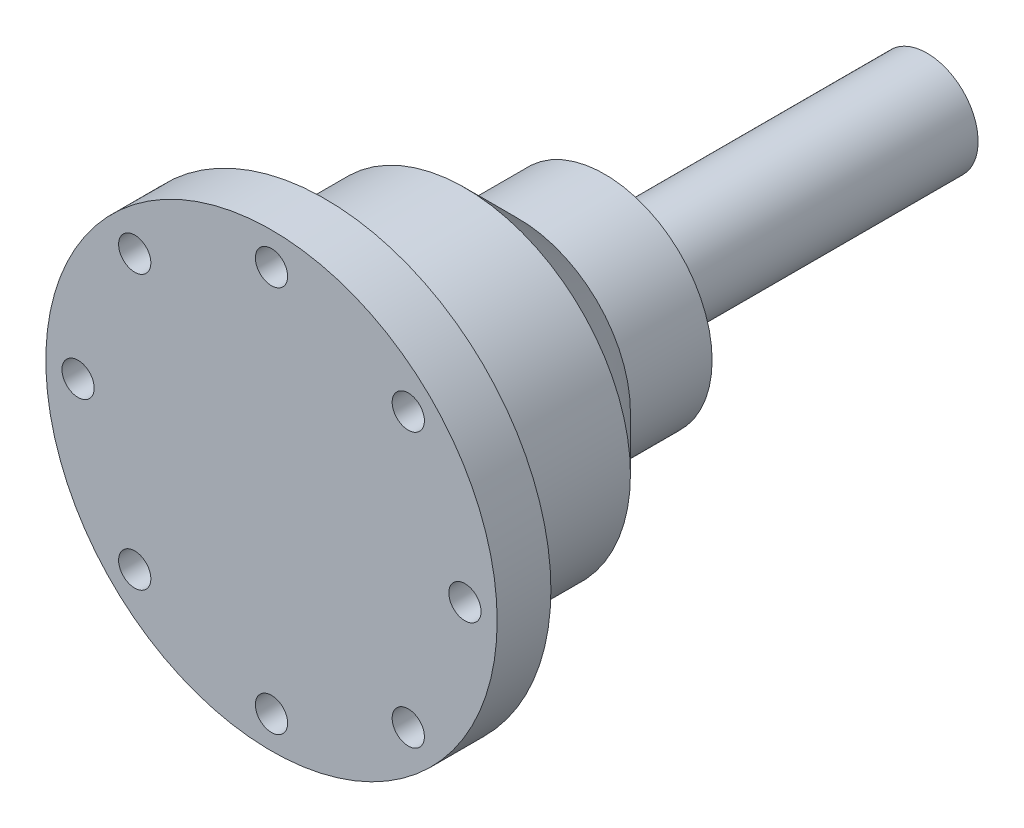
ISO-10303-21;
HEADER;
FILE_DESCRIPTION(('STEP AP214'),'2;1');
FILE_NAME('part.step','',(''),(''),'','','');
FILE_SCHEMA(('AUTOMOTIVE_DESIGN { 1 0 10303 214 1 1 1 1 }'));
ENDSEC;
DATA;
#1=APPLICATION_CONTEXT('core data for automotive mechanical design processes');
#2=APPLICATION_PROTOCOL_DEFINITION('international standard','automotive_design',2000,#1);
#3=PRODUCT_CONTEXT('',#1,'mechanical');
#4=PRODUCT('Part','Part','',(#3));
#5=PRODUCT_RELATED_PRODUCT_CATEGORY('part','',(#4));
#6=PRODUCT_DEFINITION_FORMATION('','',#4);
#7=PRODUCT_DEFINITION_CONTEXT('part definition',#1,'design');
#8=PRODUCT_DEFINITION('design','',#6,#7);
#9=PRODUCT_DEFINITION_SHAPE('','',#8);
#10=(LENGTH_UNIT() NAMED_UNIT(*) SI_UNIT(.MILLI.,.METRE.));
#11=(NAMED_UNIT(*) PLANE_ANGLE_UNIT() SI_UNIT($,.RADIAN.));
#12=(NAMED_UNIT(*) SI_UNIT($,.STERADIAN.) SOLID_ANGLE_UNIT());
#13=UNCERTAINTY_MEASURE_WITH_UNIT(LENGTH_MEASURE(1.E-05),#10,'distance_accuracy_value','');
#14=(GEOMETRIC_REPRESENTATION_CONTEXT(3) GLOBAL_UNCERTAINTY_ASSIGNED_CONTEXT((#13)) GLOBAL_UNIT_ASSIGNED_CONTEXT((#10,
#11,#12)) REPRESENTATION_CONTEXT('',''));
#15=CARTESIAN_POINT('',(0.,0.,0.));
#16=DIRECTION('',(0.,0.,1.));
#17=DIRECTION('',(1.,0.,0.));
#18=AXIS2_PLACEMENT_3D('',#15,#16,#17);
#19=CARTESIAN_POINT('',(0.,0.,5.));
#20=DIRECTION('',(0.,0.,-1.));
#21=DIRECTION('',(-1.,0.,0.));
#22=AXIS2_PLACEMENT_3D('',#19,#20,#21);
#23=CYLINDRICAL_SURFACE('',#22,21.);
#24=CARTESIAN_POINT('',(0.,0.,5.));
#25=DIRECTION('',(0.,0.,1.));
#26=DIRECTION('',(1.,0.,0.));
#27=AXIS2_PLACEMENT_3D('',#24,#25,#26);
#28=CIRCLE('',#27,21.);
#29=CARTESIAN_POINT('',(21.,0.,5.));
#30=VERTEX_POINT('',#29);
#31=EDGE_CURVE('E143',#30,#30,#28,.T.);
#32=ORIENTED_EDGE('',*,*,#31,.F.);
#33=EDGE_LOOP('',(#32));
#34=FACE_BOUND('',#33,.T.);
#35=CARTESIAN_POINT('',(0.,0.,0.));
#36=DIRECTION('',(0.,0.,1.));
#37=DIRECTION('',(1.,0.,0.));
#38=AXIS2_PLACEMENT_3D('',#35,#36,#37);
#39=CIRCLE('',#38,21.);
#40=CARTESIAN_POINT('',(21.,0.,0.));
#41=VERTEX_POINT('',#40);
#42=EDGE_CURVE('E139',#41,#41,#39,.T.);
#43=ORIENTED_EDGE('',*,*,#42,.T.);
#44=EDGE_LOOP('',(#43));
#45=FACE_BOUND('',#44,.T.);
#46=ADVANCED_FACE('F47',(#34,#45),#23,.T.);
#47=CARTESIAN_POINT('',(0.,0.,5.));
#48=DIRECTION('',(0.,0.,1.));
#49=DIRECTION('',(1.,0.,0.));
#50=AXIS2_PLACEMENT_3D('',#47,#48,#49);
#51=PLANE('',#50);
#52=CARTESIAN_POINT('',(-18.,0.,5.));
#53=DIRECTION('',(0.,0.,-1.));
#54=DIRECTION('',(0.,-1.,0.));
#55=AXIS2_PLACEMENT_3D('',#52,#53,#54);
#56=CIRCLE('',#55,1.5);
#57=CARTESIAN_POINT('',(-18.,-1.50000000000006,5.));
#58=VERTEX_POINT('',#57);
#59=EDGE_CURVE('E91',#58,#58,#56,.T.);
#60=ORIENTED_EDGE('',*,*,#59,.T.);
#61=EDGE_LOOP('',(#60));
#62=FACE_BOUND('',#61,.T.);
#63=CARTESIAN_POINT('',(-12.7279220613578,-12.7279220613579,5.));
#64=DIRECTION('',(0.,0.,-1.));
#65=DIRECTION('',(0.707106781186551,-0.707106781186544,0.));
#66=AXIS2_PLACEMENT_3D('',#63,#64,#65);
#67=CIRCLE('',#66,1.5);
#68=CARTESIAN_POINT('',(-11.667261889578,-13.7885822331377,5.));
#69=VERTEX_POINT('',#68);
#70=EDGE_CURVE('E100',#69,#69,#67,.T.);
#71=ORIENTED_EDGE('',*,*,#70,.T.);
#72=EDGE_LOOP('',(#71));
#73=FACE_BOUND('',#72,.T.);
#74=CARTESIAN_POINT('',(0.,-18.,5.));
#75=DIRECTION('',(0.,0.,-1.));
#76=DIRECTION('',(1.,0.,0.));
#77=AXIS2_PLACEMENT_3D('',#74,#75,#76);
#78=CIRCLE('',#77,1.5);
#79=CARTESIAN_POINT('',(1.5,-18.,5.));
#80=VERTEX_POINT('',#79);
#81=EDGE_CURVE('E108',#80,#80,#78,.T.);
#82=ORIENTED_EDGE('',*,*,#81,.T.);
#83=EDGE_LOOP('',(#82));
#84=FACE_BOUND('',#83,.T.);
#85=CARTESIAN_POINT('',(12.727922061358,-12.7279220613577,5.));
#86=DIRECTION('',(0.,0.,-1.));
#87=DIRECTION('',(0.707106781186541,0.707106781186554,0.));
#88=AXIS2_PLACEMENT_3D('',#85,#86,#87);
#89=CIRCLE('',#88,1.5);
#90=CARTESIAN_POINT('',(13.7885822331378,-11.6672618895779,5.));
#91=VERTEX_POINT('',#90);
#92=EDGE_CURVE('E116',#91,#91,#89,.T.);
#93=ORIENTED_EDGE('',*,*,#92,.T.);
#94=EDGE_LOOP('',(#93));
#95=FACE_BOUND('',#94,.T.);
#96=CARTESIAN_POINT('',(18.,1.88539992297529E-13,5.));
#97=DIRECTION('',(0.,0.,-1.));
#98=DIRECTION('',(0.,1.,0.));
#99=AXIS2_PLACEMENT_3D('',#96,#97,#98);
#100=CIRCLE('',#99,1.5);
#101=CARTESIAN_POINT('',(18.,1.50000000000019,5.));
#102=VERTEX_POINT('',#101);
#103=EDGE_CURVE('E75',#102,#102,#100,.T.);
#104=ORIENTED_EDGE('',*,*,#103,.T.);
#105=EDGE_LOOP('',(#104));
#106=FACE_BOUND('',#105,.T.);
#107=CARTESIAN_POINT('',(12.7279220613577,12.727922061358,5.));
#108=DIRECTION('',(0.,0.,-1.));
#109=DIRECTION('',(-0.707106781186556,0.707106781186539,0.));
#110=AXIS2_PLACEMENT_3D('',#107,#108,#109);
#111=CIRCLE('',#110,1.5);
#112=CARTESIAN_POINT('',(11.6672618895779,13.7885822331378,5.));
#113=VERTEX_POINT('',#112);
#114=EDGE_CURVE('E84',#113,#113,#111,.T.);
#115=ORIENTED_EDGE('',*,*,#114,.T.);
#116=EDGE_LOOP('',(#115));
#117=FACE_BOUND('',#116,.T.);
#118=CARTESIAN_POINT('',(-12.7279220613579,12.7279220613578,5.));
#119=DIRECTION('',(0.,0.,-1.));
#120=DIRECTION('',(-0.707106781186546,-0.707106781186549,0.));
#121=AXIS2_PLACEMENT_3D('',#118,#119,#120);
#122=CIRCLE('',#121,1.5);
#123=CARTESIAN_POINT('',(-13.7885822331377,11.667261889578,5.));
#124=VERTEX_POINT('',#123);
#125=EDGE_CURVE('E123',#124,#124,#122,.T.);
#126=ORIENTED_EDGE('',*,*,#125,.T.);
#127=EDGE_LOOP('',(#126));
#128=FACE_BOUND('',#127,.T.);
#129=CARTESIAN_POINT('',(0.,18.,5.));
#130=DIRECTION('',(0.,0.,-1.));
#131=DIRECTION('',(-1.,0.,0.));
#132=AXIS2_PLACEMENT_3D('',#129,#130,#131);
#133=CIRCLE('',#132,1.5);
#134=CARTESIAN_POINT('',(-1.5,18.,5.));
#135=VERTEX_POINT('',#134);
#136=EDGE_CURVE('E135',#135,#135,#133,.T.);
#137=ORIENTED_EDGE('',*,*,#136,.T.);
#138=EDGE_LOOP('',(#137));
#139=FACE_BOUND('',#138,.T.);
#140=ORIENTED_EDGE('',*,*,#31,.T.);
#141=EDGE_LOOP('',(#140));
#142=FACE_BOUND('',#141,.T.);
#143=ADVANCED_FACE('F174',(#62,#73,#84,#95,#106,#117,#128,#139,#142),#51,.T.);
#144=CARTESIAN_POINT('',(0.,0.,0.));
#145=DIRECTION('',(0.,0.,1.));
#146=DIRECTION('',(1.,0.,0.));
#147=AXIS2_PLACEMENT_3D('',#144,#145,#146);
#148=PLANE('',#147);
#149=CARTESIAN_POINT('',(0.,0.,0.));
#150=DIRECTION('',(0.,0.,1.));
#151=DIRECTION('',(1.,0.,0.));
#152=AXIS2_PLACEMENT_3D('',#149,#150,#151);
#153=CIRCLE('',#152,15.4);
#154=CARTESIAN_POINT('',(15.4,0.,0.));
#155=VERTEX_POINT('',#154);
#156=EDGE_CURVE('E71',#155,#155,#153,.T.);
#157=ORIENTED_EDGE('',*,*,#156,.T.);
#158=EDGE_LOOP('',(#157));
#159=FACE_BOUND('',#158,.T.);
#160=CARTESIAN_POINT('',(-18.,0.,0.));
#161=DIRECTION('',(0.,0.,-1.));
#162=DIRECTION('',(0.,-1.,0.));
#163=AXIS2_PLACEMENT_3D('',#160,#161,#162);
#164=CIRCLE('',#163,1.5);
#165=CARTESIAN_POINT('',(-18.,-1.50000000000006,0.));
#166=VERTEX_POINT('',#165);
#167=EDGE_CURVE('E96',#166,#166,#164,.T.);
#168=ORIENTED_EDGE('',*,*,#167,.F.);
#169=EDGE_LOOP('',(#168));
#170=FACE_BOUND('',#169,.T.);
#171=CARTESIAN_POINT('',(-12.7279220613578,-12.7279220613579,0.));
#172=DIRECTION('',(0.,0.,-1.));
#173=DIRECTION('',(0.707106781186551,-0.707106781186544,0.));
#174=AXIS2_PLACEMENT_3D('',#171,#172,#173);
#175=CIRCLE('',#174,1.5);
#176=CARTESIAN_POINT('',(-11.667261889578,-13.7885822331377,0.));
#177=VERTEX_POINT('',#176);
#178=EDGE_CURVE('E104',#177,#177,#175,.T.);
#179=ORIENTED_EDGE('',*,*,#178,.F.);
#180=EDGE_LOOP('',(#179));
#181=FACE_BOUND('',#180,.T.);
#182=CARTESIAN_POINT('',(0.,-18.,0.));
#183=DIRECTION('',(0.,0.,-1.));
#184=DIRECTION('',(1.,0.,0.));
#185=AXIS2_PLACEMENT_3D('',#182,#183,#184);
#186=CIRCLE('',#185,1.5);
#187=CARTESIAN_POINT('',(1.5,-18.,0.));
#188=VERTEX_POINT('',#187);
#189=EDGE_CURVE('E112',#188,#188,#186,.T.);
#190=ORIENTED_EDGE('',*,*,#189,.F.);
#191=EDGE_LOOP('',(#190));
#192=FACE_BOUND('',#191,.T.);
#193=CARTESIAN_POINT('',(12.727922061358,-12.7279220613577,0.));
#194=DIRECTION('',(0.,0.,-1.));
#195=DIRECTION('',(0.707106781186541,0.707106781186554,0.));
#196=AXIS2_PLACEMENT_3D('',#193,#194,#195);
#197=CIRCLE('',#196,1.5);
#198=CARTESIAN_POINT('',(13.7885822331378,-11.6672618895779,0.));
#199=VERTEX_POINT('',#198);
#200=EDGE_CURVE('E79',#199,#199,#197,.T.);
#201=ORIENTED_EDGE('',*,*,#200,.F.);
#202=EDGE_LOOP('',(#201));
#203=FACE_BOUND('',#202,.T.);
#204=CARTESIAN_POINT('',(18.,1.88539992297529E-13,0.));
#205=DIRECTION('',(0.,0.,-1.));
#206=DIRECTION('',(0.,1.,0.));
#207=AXIS2_PLACEMENT_3D('',#204,#205,#206);
#208=CIRCLE('',#207,1.5);
#209=CARTESIAN_POINT('',(18.,1.50000000000019,0.));
#210=VERTEX_POINT('',#209);
#211=EDGE_CURVE('E80',#210,#210,#208,.T.);
#212=ORIENTED_EDGE('',*,*,#211,.F.);
#213=EDGE_LOOP('',(#212));
#214=FACE_BOUND('',#213,.T.);
#215=CARTESIAN_POINT('',(12.7279220613577,12.727922061358,0.));
#216=DIRECTION('',(0.,0.,-1.));
#217=DIRECTION('',(-0.707106781186556,0.707106781186539,0.));
#218=AXIS2_PLACEMENT_3D('',#215,#216,#217);
#219=CIRCLE('',#218,1.5);
#220=CARTESIAN_POINT('',(11.6672618895779,13.7885822331378,0.));
#221=VERTEX_POINT('',#220);
#222=EDGE_CURVE('E70',#221,#221,#219,.T.);
#223=ORIENTED_EDGE('',*,*,#222,.F.);
#224=EDGE_LOOP('',(#223));
#225=FACE_BOUND('',#224,.T.);
#226=CARTESIAN_POINT('',(-12.7279220613579,12.7279220613578,0.));
#227=DIRECTION('',(0.,0.,-1.));
#228=DIRECTION('',(-0.707106781186546,-0.707106781186549,0.));
#229=AXIS2_PLACEMENT_3D('',#226,#227,#228);
#230=CIRCLE('',#229,1.5);
#231=CARTESIAN_POINT('',(-13.7885822331377,11.667261889578,0.));
#232=VERTEX_POINT('',#231);
#233=EDGE_CURVE('E95',#232,#232,#230,.T.);
#234=ORIENTED_EDGE('',*,*,#233,.F.);
#235=EDGE_LOOP('',(#234));
#236=FACE_BOUND('',#235,.T.);
#237=CARTESIAN_POINT('',(0.,18.,0.));
#238=DIRECTION('',(0.,0.,-1.));
#239=DIRECTION('',(-1.,0.,0.));
#240=AXIS2_PLACEMENT_3D('',#237,#238,#239);
#241=CIRCLE('',#240,1.5);
#242=CARTESIAN_POINT('',(-1.5,18.,0.));
#243=VERTEX_POINT('',#242);
#244=EDGE_CURVE('E134',#243,#243,#241,.T.);
#245=ORIENTED_EDGE('',*,*,#244,.F.);
#246=EDGE_LOOP('',(#245));
#247=FACE_BOUND('',#246,.T.);
#248=ORIENTED_EDGE('',*,*,#42,.F.);
#249=EDGE_LOOP('',(#248));
#250=FACE_BOUND('',#249,.T.);
#251=ADVANCED_FACE('F180',(#159,#170,#181,#192,#203,#214,#225,#236,#247,#250),#148,.F.);
#252=CARTESIAN_POINT('',(0.,18.,5.));
#253=DIRECTION('',(0.,0.,-1.));
#254=DIRECTION('',(-1.,0.,0.));
#255=AXIS2_PLACEMENT_3D('',#252,#253,#254);
#256=CYLINDRICAL_SURFACE('',#255,1.5);
#257=ORIENTED_EDGE('',*,*,#136,.F.);
#258=EDGE_LOOP('',(#257));
#259=FACE_BOUND('',#258,.T.);
#260=ORIENTED_EDGE('',*,*,#244,.T.);
#261=EDGE_LOOP('',(#260));
#262=FACE_BOUND('',#261,.T.);
#263=ADVANCED_FACE('F187',(#259,#262),#256,.F.);
#264=CARTESIAN_POINT('',(-12.7279220613579,12.7279220613578,5.));
#265=DIRECTION('',(0.,0.,-1.));
#266=DIRECTION('',(-1.,0.,0.));
#267=AXIS2_PLACEMENT_3D('',#264,#265,#266);
#268=CYLINDRICAL_SURFACE('',#267,1.5);
#269=ORIENTED_EDGE('',*,*,#125,.F.);
#270=EDGE_LOOP('',(#269));
#271=FACE_BOUND('',#270,.T.);
#272=ORIENTED_EDGE('',*,*,#233,.T.);
#273=EDGE_LOOP('',(#272));
#274=FACE_BOUND('',#273,.T.);
#275=ADVANCED_FACE('F190',(#271,#274),#268,.F.);
#276=CARTESIAN_POINT('',(12.7279220613577,12.727922061358,5.));
#277=DIRECTION('',(0.,0.,-1.));
#278=DIRECTION('',(-1.,0.,0.));
#279=AXIS2_PLACEMENT_3D('',#276,#277,#278);
#280=CYLINDRICAL_SURFACE('',#279,1.5);
#281=ORIENTED_EDGE('',*,*,#114,.F.);
#282=EDGE_LOOP('',(#281));
#283=FACE_BOUND('',#282,.T.);
#284=ORIENTED_EDGE('',*,*,#222,.T.);
#285=EDGE_LOOP('',(#284));
#286=FACE_BOUND('',#285,.T.);
#287=ADVANCED_FACE('F198',(#283,#286),#280,.F.);
#288=CARTESIAN_POINT('',(18.,1.88539992297529E-13,5.));
#289=DIRECTION('',(0.,0.,-1.));
#290=DIRECTION('',(-1.,0.,0.));
#291=AXIS2_PLACEMENT_3D('',#288,#289,#290);
#292=CYLINDRICAL_SURFACE('',#291,1.5);
#293=ORIENTED_EDGE('',*,*,#103,.F.);
#294=EDGE_LOOP('',(#293));
#295=FACE_BOUND('',#294,.T.);
#296=ORIENTED_EDGE('',*,*,#211,.T.);
#297=EDGE_LOOP('',(#296));
#298=FACE_BOUND('',#297,.T.);
#299=ADVANCED_FACE('F204',(#295,#298),#292,.F.);
#300=CARTESIAN_POINT('',(12.727922061358,-12.7279220613577,5.));
#301=DIRECTION('',(0.,0.,-1.));
#302=DIRECTION('',(-1.,0.,0.));
#303=AXIS2_PLACEMENT_3D('',#300,#301,#302);
#304=CYLINDRICAL_SURFACE('',#303,1.5);
#305=ORIENTED_EDGE('',*,*,#92,.F.);
#306=EDGE_LOOP('',(#305));
#307=FACE_BOUND('',#306,.T.);
#308=ORIENTED_EDGE('',*,*,#200,.T.);
#309=EDGE_LOOP('',(#308));
#310=FACE_BOUND('',#309,.T.);
#311=ADVANCED_FACE('F200',(#307,#310),#304,.F.);
#312=CARTESIAN_POINT('',(0.,-18.,5.));
#313=DIRECTION('',(0.,0.,-1.));
#314=DIRECTION('',(-1.,0.,0.));
#315=AXIS2_PLACEMENT_3D('',#312,#313,#314);
#316=CYLINDRICAL_SURFACE('',#315,1.5);
#317=ORIENTED_EDGE('',*,*,#81,.F.);
#318=EDGE_LOOP('',(#317));
#319=FACE_BOUND('',#318,.T.);
#320=ORIENTED_EDGE('',*,*,#189,.T.);
#321=EDGE_LOOP('',(#320));
#322=FACE_BOUND('',#321,.T.);
#323=ADVANCED_FACE('F203',(#319,#322),#316,.F.);
#324=CARTESIAN_POINT('',(-12.7279220613578,-12.7279220613579,5.));
#325=DIRECTION('',(0.,0.,-1.));
#326=DIRECTION('',(-1.,0.,0.));
#327=AXIS2_PLACEMENT_3D('',#324,#325,#326);
#328=CYLINDRICAL_SURFACE('',#327,1.5);
#329=ORIENTED_EDGE('',*,*,#70,.F.);
#330=EDGE_LOOP('',(#329));
#331=FACE_BOUND('',#330,.T.);
#332=ORIENTED_EDGE('',*,*,#178,.T.);
#333=EDGE_LOOP('',(#332));
#334=FACE_BOUND('',#333,.T.);
#335=ADVANCED_FACE('F208',(#331,#334),#328,.F.);
#336=CARTESIAN_POINT('',(-18.,0.,5.));
#337=DIRECTION('',(0.,0.,-1.));
#338=DIRECTION('',(-1.,0.,0.));
#339=AXIS2_PLACEMENT_3D('',#336,#337,#338);
#340=CYLINDRICAL_SURFACE('',#339,1.5);
#341=ORIENTED_EDGE('',*,*,#59,.F.);
#342=EDGE_LOOP('',(#341));
#343=FACE_BOUND('',#342,.T.);
#344=ORIENTED_EDGE('',*,*,#167,.T.);
#345=EDGE_LOOP('',(#344));
#346=FACE_BOUND('',#345,.T.);
#347=ADVANCED_FACE('F212',(#343,#346),#340,.F.);
#348=CARTESIAN_POINT('',(0.,0.,-18.));
#349=DIRECTION('',(0.,0.,1.));
#350=DIRECTION('',(1.,0.,0.));
#351=AXIS2_PLACEMENT_3D('',#348,#349,#350);
#352=CYLINDRICAL_SURFACE('',#351,15.4);
#353=CARTESIAN_POINT('',(0.,0.,-13.));
#354=DIRECTION('',(0.,0.,1.));
#355=DIRECTION('',(1.,0.,0.));
#356=AXIS2_PLACEMENT_3D('',#353,#354,#355);
#357=CIRCLE('',#356,15.4);
#358=CARTESIAN_POINT('',(15.4,0.,-13.));
#359=VERTEX_POINT('',#358);
#360=EDGE_CURVE('E62',#359,#359,#357,.T.);
#361=ORIENTED_EDGE('',*,*,#360,.T.);
#362=EDGE_LOOP('',(#361));
#363=FACE_BOUND('',#362,.T.);
#364=ORIENTED_EDGE('',*,*,#156,.F.);
#365=EDGE_LOOP('',(#364));
#366=FACE_BOUND('',#365,.T.);
#367=ADVANCED_FACE('F153',(#363,#366),#352,.T.);
#368=CARTESIAN_POINT('',(0.,0.,-18.));
#369=DIRECTION('',(0.,0.,1.));
#370=DIRECTION('',(1.,0.,0.));
#371=AXIS2_PLACEMENT_3D('',#368,#369,#370);
#372=PLANE('',#371);
#373=CARTESIAN_POINT('',(0.,0.,-18.));
#374=DIRECTION('',(0.,0.,1.));
#375=DIRECTION('',(1.,0.,0.));
#376=AXIS2_PLACEMENT_3D('',#373,#374,#375);
#377=CIRCLE('',#376,10.4);
#378=CARTESIAN_POINT('',(10.4,0.,-18.));
#379=VERTEX_POINT('',#378);
#380=EDGE_CURVE('E52',#379,#379,#377,.F.);
#381=ORIENTED_EDGE('',*,*,#380,.T.);
#382=EDGE_LOOP('',(#381));
#383=FACE_BOUND('',#382,.T.);
#384=CARTESIAN_POINT('',(0.,0.,-18.));
#385=DIRECTION('',(0.,0.,1.));
#386=DIRECTION('',(1.,0.,0.));
#387=AXIS2_PLACEMENT_3D('',#384,#385,#386);
#388=CIRCLE('',#387,10.);
#389=CARTESIAN_POINT('',(10.,0.,-18.));
#390=VERTEX_POINT('',#389);
#391=EDGE_CURVE('E66',#390,#390,#388,.T.);
#392=ORIENTED_EDGE('',*,*,#391,.T.);
#393=EDGE_LOOP('',(#392));
#394=FACE_BOUND('',#393,.T.);
#395=ADVANCED_FACE('F194',(#383,#394),#372,.F.);
#396=CARTESIAN_POINT('',(0.,0.,-26.));
#397=DIRECTION('',(0.,0.,1.));
#398=DIRECTION('',(1.,0.,0.));
#399=AXIS2_PLACEMENT_3D('',#396,#397,#398);
#400=PLANE('',#399);
#401=CARTESIAN_POINT('',(0.,0.,-26.));
#402=DIRECTION('',(0.,0.,-1.));
#403=DIRECTION('',(-1.,0.,0.));
#404=AXIS2_PLACEMENT_3D('',#401,#402,#403);
#405=CIRCLE('',#404,4.75);
#406=CARTESIAN_POINT('',(-4.75,0.,-26.));
#407=VERTEX_POINT('',#406);
#408=EDGE_CURVE('E10',#407,#407,#405,.T.);
#409=ORIENTED_EDGE('',*,*,#408,.F.);
#410=EDGE_LOOP('',(#409));
#411=FACE_BOUND('',#410,.T.);
#412=CARTESIAN_POINT('',(0.,0.,-26.));
#413=DIRECTION('',(0.,0.,1.));
#414=DIRECTION('',(1.,0.,0.));
#415=AXIS2_PLACEMENT_3D('',#412,#413,#414);
#416=CIRCLE('',#415,10.);
#417=CARTESIAN_POINT('',(10.,0.,-26.));
#418=VERTEX_POINT('',#417);
#419=EDGE_CURVE('E127',#418,#418,#416,.T.);
#420=ORIENTED_EDGE('',*,*,#419,.F.);
#421=EDGE_LOOP('',(#420));
#422=FACE_BOUND('',#421,.T.);
#423=ADVANCED_FACE('F169',(#411,#422),#400,.F.);
#424=CARTESIAN_POINT('',(0.,0.,-26.));
#425=DIRECTION('',(0.,0.,1.));
#426=DIRECTION('',(1.,0.,0.));
#427=AXIS2_PLACEMENT_3D('',#424,#425,#426);
#428=CYLINDRICAL_SURFACE('',#427,10.);
#429=CARTESIAN_POINT('',(10.,0.,-26.));
#430=CARTESIAN_POINT('',(10.,0.,-25.9166666666667));
#431=CARTESIAN_POINT('',(10.,0.,-25.8333333333333));
#432=CARTESIAN_POINT('',(10.,0.,-25.6666666666667));
#433=CARTESIAN_POINT('',(10.,0.,-25.5833333333333));
#434=CARTESIAN_POINT('',(10.,0.,-25.4166666666667));
#435=CARTESIAN_POINT('',(10.,0.,-25.3333333333333));
#436=CARTESIAN_POINT('',(10.,0.,-25.1666666666667));
#437=CARTESIAN_POINT('',(10.,0.,-25.0833333333333));
#438=CARTESIAN_POINT('',(10.,0.,-24.9166666666667));
#439=CARTESIAN_POINT('',(10.,0.,-24.8333333333333));
#440=CARTESIAN_POINT('',(10.,0.,-24.6666666666667));
#441=CARTESIAN_POINT('',(10.,0.,-24.5833333333333));
#442=CARTESIAN_POINT('',(10.,0.,-24.4166666666667));
#443=CARTESIAN_POINT('',(10.,0.,-24.3333333333333));
#444=CARTESIAN_POINT('',(10.,0.,-24.1666666666667));
#445=CARTESIAN_POINT('',(10.,0.,-24.0833333333333));
#446=CARTESIAN_POINT('',(10.,0.,-23.9166666666667));
#447=CARTESIAN_POINT('',(10.,0.,-23.8333333333333));
#448=CARTESIAN_POINT('',(10.,0.,-23.6666666666667));
#449=CARTESIAN_POINT('',(10.,0.,-23.5833333333333));
#450=CARTESIAN_POINT('',(10.,0.,-23.4166666666667));
#451=CARTESIAN_POINT('',(10.,0.,-23.3333333333333));
#452=CARTESIAN_POINT('',(10.,0.,-23.1666666666667));
#453=CARTESIAN_POINT('',(10.,0.,-23.0833333333333));
#454=CARTESIAN_POINT('',(10.,0.,-22.9166666666667));
#455=CARTESIAN_POINT('',(10.,0.,-22.8333333333333));
#456=CARTESIAN_POINT('',(10.,0.,-22.6666666666667));
#457=CARTESIAN_POINT('',(10.,0.,-22.5833333333333));
#458=CARTESIAN_POINT('',(10.,0.,-22.4166666666667));
#459=CARTESIAN_POINT('',(10.,0.,-22.3333333333333));
#460=CARTESIAN_POINT('',(10.,0.,-22.1666666666667));
#461=CARTESIAN_POINT('',(10.,0.,-22.0833333333333));
#462=CARTESIAN_POINT('',(10.,0.,-21.9166666666667));
#463=CARTESIAN_POINT('',(10.,0.,-21.8333333333333));
#464=CARTESIAN_POINT('',(10.,0.,-21.6666666666667));
#465=CARTESIAN_POINT('',(10.,0.,-21.5833333333333));
#466=CARTESIAN_POINT('',(10.,0.,-21.4166666666667));
#467=CARTESIAN_POINT('',(10.,0.,-21.3333333333333));
#468=CARTESIAN_POINT('',(10.,0.,-21.1666666666667));
#469=CARTESIAN_POINT('',(10.,0.,-21.0833333333333));
#470=CARTESIAN_POINT('',(10.,0.,-20.9166666666667));
#471=CARTESIAN_POINT('',(10.,0.,-20.8333333333333));
#472=CARTESIAN_POINT('',(10.,0.,-20.6666666666667));
#473=CARTESIAN_POINT('',(10.,0.,-20.5833333333333));
#474=CARTESIAN_POINT('',(10.,0.,-20.4166666666667));
#475=CARTESIAN_POINT('',(10.,0.,-20.3333333333333));
#476=CARTESIAN_POINT('',(10.,0.,-20.1666666666667));
#477=CARTESIAN_POINT('',(10.,0.,-20.0833333333333));
#478=CARTESIAN_POINT('',(10.,0.,-19.9166666666667));
#479=CARTESIAN_POINT('',(10.,0.,-19.8333333333333));
#480=CARTESIAN_POINT('',(10.,0.,-19.6666666666667));
#481=CARTESIAN_POINT('',(10.,0.,-19.5833333333333));
#482=CARTESIAN_POINT('',(10.,0.,-19.4166666666667));
#483=CARTESIAN_POINT('',(10.,0.,-19.3333333333333));
#484=CARTESIAN_POINT('',(10.,0.,-19.1666666666667));
#485=CARTESIAN_POINT('',(10.,0.,-19.0833333333333));
#486=CARTESIAN_POINT('',(10.,0.,-18.9166666666667));
#487=CARTESIAN_POINT('',(10.,0.,-18.8333333333333));
#488=CARTESIAN_POINT('',(10.,0.,-18.6666666666667));
#489=CARTESIAN_POINT('',(10.,0.,-18.5833333333333));
#490=CARTESIAN_POINT('',(10.,0.,-18.4166666666667));
#491=CARTESIAN_POINT('',(10.,0.,-18.3333333333333));
#492=CARTESIAN_POINT('',(10.,0.,-18.1666666666667));
#493=CARTESIAN_POINT('',(10.,0.,-18.0833333333333));
#494=CARTESIAN_POINT('',(10.,0.,-18.));
#495=B_SPLINE_CURVE_WITH_KNOTS('',3,(#429,#430,#431,#432,#433,#434,#435,#436,#437,#438,#439,
#440,#441,#442,#443,#444,#445,#446,#447,#448,#449,#450,#451,#452,#453,#454,#455,#456,#457,#458,
#459,#460,#461,#462,#463,#464,#465,#466,#467,#468,#469,#470,#471,#472,#473,#474,#475,#476,#477,
#478,#479,#480,#481,#482,#483,#484,#485,#486,#487,#488,#489,#490,#491,#492,#493,#494),
.UNSPECIFIED.,.F.,.F.,(4,2,2,2,2,2,2,2,2,2,2,2,2,2,2,2,2,2,2,2,2,2,2,2,2,2,2,2,2,2,2,2,4),(0.,
0.249999999999997,0.499999999999997,0.749999999999997,0.999999999999997,1.25,1.5,1.75,2.,2.25,
2.5,2.75,3.,3.25,3.5,3.75,4.,4.25,4.5,4.75,5.,5.25,5.5,5.75,6.,6.25,6.5,6.75,7.,7.25,7.5,7.75,
8.),.UNSPECIFIED.);
#496=EDGE_CURVE('BSEAM158',#418,#390,#495,.T.);
#497=ORIENTED_EDGE('',*,*,#419,.T.);
#498=ORIENTED_EDGE('',*,*,#391,.F.);
#499=ORIENTED_EDGE('',*,*,#496,.T.);
#500=ORIENTED_EDGE('',*,*,#496,.F.);
#501=EDGE_LOOP('',(#497,#499,#498,#500));
#502=FACE_BOUND('',#501,.T.);
#503=ADVANCED_FACE('F158',(#502),#428,.T.);
#504=CARTESIAN_POINT('',(0.,0.,-13.));
#505=DIRECTION('',(0.,0.,1.));
#506=DIRECTION('',(1.,0.,0.));
#507=AXIS2_PLACEMENT_3D('',#504,#505,#506);
#508=CONICAL_SURFACE('',#507,15.4,0.78539816339745);
#509=ORIENTED_EDGE('',*,*,#380,.F.);
#510=EDGE_LOOP('',(#509));
#511=FACE_BOUND('',#510,.T.);
#512=ORIENTED_EDGE('',*,*,#360,.F.);
#513=EDGE_LOOP('',(#512));
#514=FACE_BOUND('',#513,.T.);
#515=ADVANCED_FACE('F50',(#511,#514),#508,.T.);
#516=CARTESIAN_POINT('',(0.,0.,-56.));
#517=DIRECTION('',(0.,0.,1.));
#518=DIRECTION('',(1.,0.,0.));
#519=AXIS2_PLACEMENT_3D('',#516,#517,#518);
#520=CYLINDRICAL_SURFACE('',#519,4.75);
#521=CARTESIAN_POINT('',(0.,0.,-56.));
#522=DIRECTION('',(0.,0.,-1.));
#523=DIRECTION('',(-1.,0.,0.));
#524=AXIS2_PLACEMENT_3D('',#521,#522,#523);
#525=CIRCLE('',#524,4.75);
#526=CARTESIAN_POINT('',(-4.75,0.,-56.));
#527=VERTEX_POINT('',#526);
#528=EDGE_CURVE('E65',#527,#527,#525,.T.);
#529=ORIENTED_EDGE('',*,*,#528,.F.);
#530=EDGE_LOOP('',(#529));
#531=FACE_BOUND('',#530,.T.);
#532=ORIENTED_EDGE('',*,*,#408,.T.);
#533=EDGE_LOOP('',(#532));
#534=FACE_BOUND('',#533,.T.);
#535=ADVANCED_FACE('F157',(#531,#534),#520,.T.);
#536=CARTESIAN_POINT('',(0.,0.,-56.));
#537=DIRECTION('',(0.,0.,-1.));
#538=DIRECTION('',(-1.,0.,0.));
#539=AXIS2_PLACEMENT_3D('',#536,#537,#538);
#540=PLANE('',#539);
#541=ORIENTED_EDGE('',*,*,#528,.T.);
#542=EDGE_LOOP('',(#541));
#543=FACE_BOUND('',#542,.T.);
#544=ADVANCED_FACE('F165',(#543),#540,.T.);
#545=CLOSED_SHELL('',(#46,#143,#251,#263,#275,#287,#299,#311,#323,#335,#347,#367,#395,#423,#503,
#515,#535,#544));
#546=MANIFOLD_SOLID_BREP('B2',#545);
#547=ADVANCED_BREP_SHAPE_REPRESENTATION('',(#18,#546),#14);
#548=SHAPE_DEFINITION_REPRESENTATION(#9,#547);
ENDSEC;
END-ISO-10303-21;
